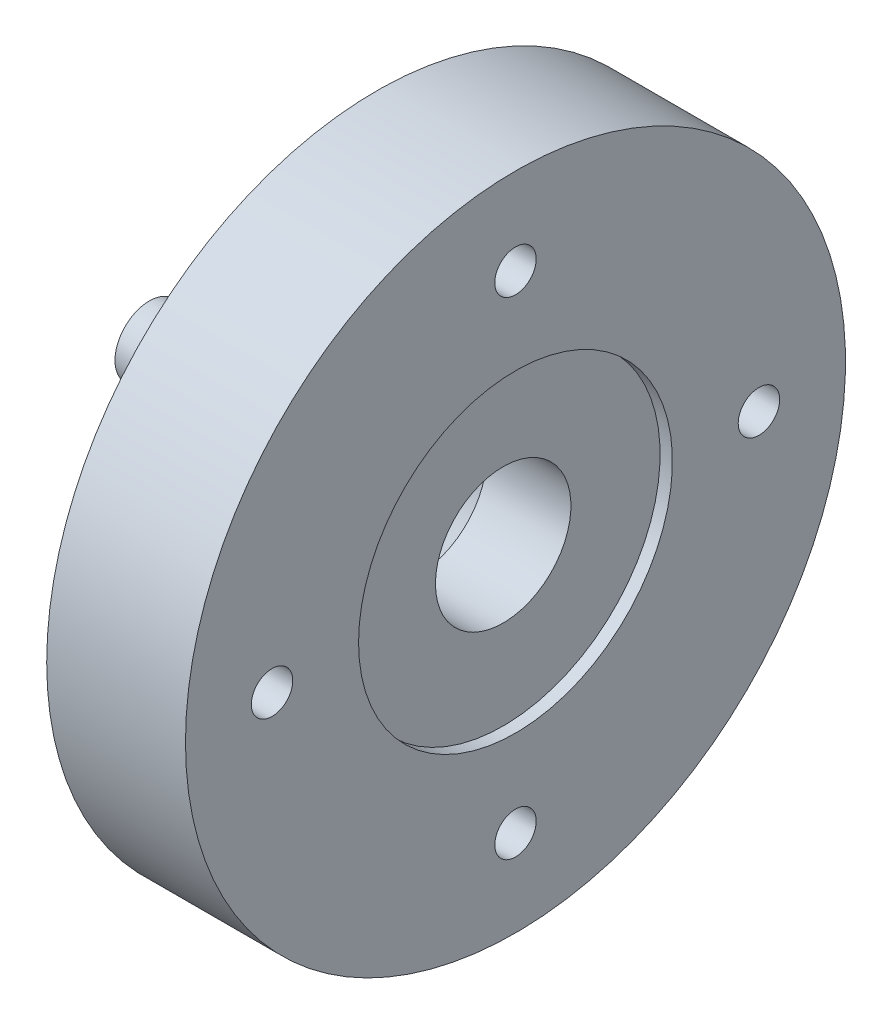
ISO-10303-21;
HEADER;
FILE_DESCRIPTION(('STEP AP214'),'2;1');
FILE_NAME('part.step','',(''),(''),'','','');
FILE_SCHEMA(('AUTOMOTIVE_DESIGN { 1 0 10303 214 1 1 1 1 }'));
ENDSEC;
DATA;
#1=APPLICATION_CONTEXT('core data for automotive mechanical design processes');
#2=APPLICATION_PROTOCOL_DEFINITION('international standard','automotive_design',2000,#1);
#3=PRODUCT_CONTEXT('',#1,'mechanical');
#4=PRODUCT('Part','Part','',(#3));
#5=PRODUCT_RELATED_PRODUCT_CATEGORY('part','',(#4));
#6=PRODUCT_DEFINITION_FORMATION('','',#4);
#7=PRODUCT_DEFINITION_CONTEXT('part definition',#1,'design');
#8=PRODUCT_DEFINITION('design','',#6,#7);
#9=PRODUCT_DEFINITION_SHAPE('','',#8);
#10=(LENGTH_UNIT() NAMED_UNIT(*) SI_UNIT(.MILLI.,.METRE.));
#11=(NAMED_UNIT(*) PLANE_ANGLE_UNIT() SI_UNIT($,.RADIAN.));
#12=(NAMED_UNIT(*) SI_UNIT($,.STERADIAN.) SOLID_ANGLE_UNIT());
#13=UNCERTAINTY_MEASURE_WITH_UNIT(LENGTH_MEASURE(1.E-05),#10,'distance_accuracy_value','');
#14=(GEOMETRIC_REPRESENTATION_CONTEXT(3) GLOBAL_UNCERTAINTY_ASSIGNED_CONTEXT((#13)) GLOBAL_UNIT_ASSIGNED_CONTEXT((#10,
#11,#12)) REPRESENTATION_CONTEXT('',''));
#15=CARTESIAN_POINT('',(0.,0.,0.));
#16=DIRECTION('',(0.,0.,1.));
#17=DIRECTION('',(1.,0.,0.));
#18=AXIS2_PLACEMENT_3D('',#15,#16,#17);
#19=CARTESIAN_POINT('',(-71.2918592683267,11.7141702218951,0.));
#20=DIRECTION('',(1.,0.,0.));
#21=DIRECTION('',(0.,0.,-1.));
#22=AXIS2_PLACEMENT_3D('',#19,#20,#21);
#23=CONICAL_SURFACE('',#22,3.17,0.0784901026373288);
#24=CARTESIAN_POINT('',(-75.7418592683269,11.7141702218951,0.));
#25=DIRECTION('',(-1.,0.,0.));
#26=DIRECTION('',(0.,0.,1.));
#27=AXIS2_PLACEMENT_3D('',#24,#25,#26);
#28=CIRCLE('',#27,2.82);
#29=CARTESIAN_POINT('',(-75.7418592683269,11.7141702218951,2.82));
#30=VERTEX_POINT('',#29);
#31=EDGE_CURVE('E92',#30,#30,#28,.T.);
#32=ORIENTED_EDGE('',*,*,#31,.F.);
#33=EDGE_LOOP('',(#32));
#34=FACE_BOUND('',#33,.T.);
#35=CARTESIAN_POINT('',(-71.2918592683267,11.7141702218951,0.));
#36=DIRECTION('',(-1.,0.,0.));
#37=DIRECTION('',(0.,0.,1.));
#38=AXIS2_PLACEMENT_3D('',#35,#36,#37);
#39=CIRCLE('',#38,3.17);
#40=CARTESIAN_POINT('',(-71.2918592683267,11.7141702218951,3.17));
#41=VERTEX_POINT('',#40);
#42=EDGE_CURVE('E10',#41,#41,#39,.T.);
#43=ORIENTED_EDGE('',*,*,#42,.T.);
#44=EDGE_LOOP('',(#43));
#45=FACE_BOUND('',#44,.T.);
#46=ADVANCED_FACE('F37',(#34,#45),#23,.T.);
#47=CARTESIAN_POINT('',(-71.2918592683267,14.8841702218951,0.));
#48=DIRECTION('',(-1.,0.,0.));
#49=DIRECTION('',(0.,0.,1.));
#50=AXIS2_PLACEMENT_3D('',#47,#48,#49);
#51=PLANE('',#50);
#52=ORIENTED_EDGE('',*,*,#42,.F.);
#53=EDGE_LOOP('',(#52));
#54=FACE_BOUND('',#53,.T.);
#55=CARTESIAN_POINT('',(-71.2918592683267,11.7141702218951,0.));
#56=DIRECTION('',(-1.,0.,0.));
#57=DIRECTION('',(0.,0.,1.));
#58=AXIS2_PLACEMENT_3D('',#55,#56,#57);
#59=CIRCLE('',#58,2.82);
#60=CARTESIAN_POINT('',(-71.2918592683267,11.7141702218951,2.82));
#61=VERTEX_POINT('',#60);
#62=EDGE_CURVE('E43',#61,#61,#59,.T.);
#63=ORIENTED_EDGE('',*,*,#62,.T.);
#64=EDGE_LOOP('',(#63));
#65=FACE_BOUND('',#64,.T.);
#66=ADVANCED_FACE('F224',(#54,#65),#51,.F.);
#67=CARTESIAN_POINT('',(-66.841859268327,11.7141702218951,0.));
#68=DIRECTION('',(1.,0.,0.));
#69=DIRECTION('',(0.,0.,-1.));
#70=AXIS2_PLACEMENT_3D('',#67,#68,#69);
#71=CONICAL_SURFACE('',#70,3.17,0.0784901026373366);
#72=ORIENTED_EDGE('',*,*,#62,.F.);
#73=EDGE_LOOP('',(#72));
#74=FACE_BOUND('',#73,.T.);
#75=CARTESIAN_POINT('',(-66.841859268327,11.7141702218951,0.));
#76=DIRECTION('',(-1.,0.,0.));
#77=DIRECTION('',(0.,0.,1.));
#78=AXIS2_PLACEMENT_3D('',#75,#76,#77);
#79=CIRCLE('',#78,3.17);
#80=CARTESIAN_POINT('',(-66.841859268327,11.7141702218951,3.17));
#81=VERTEX_POINT('',#80);
#82=EDGE_CURVE('E47',#81,#81,#79,.T.);
#83=ORIENTED_EDGE('',*,*,#82,.T.);
#84=EDGE_LOOP('',(#83));
#85=FACE_BOUND('',#84,.T.);
#86=ADVANCED_FACE('F228',(#74,#85),#71,.T.);
#87=CARTESIAN_POINT('',(-66.8418592683269,14.8841702218951,0.));
#88=DIRECTION('',(-1.,0.,0.));
#89=DIRECTION('',(0.,0.,1.));
#90=AXIS2_PLACEMENT_3D('',#87,#88,#89);
#91=PLANE('',#90);
#92=ORIENTED_EDGE('',*,*,#82,.F.);
#93=EDGE_LOOP('',(#92));
#94=FACE_BOUND('',#93,.T.);
#95=CARTESIAN_POINT('',(-66.841859268327,11.7141702218951,0.));
#96=DIRECTION('',(-1.,0.,0.));
#97=DIRECTION('',(0.,0.,1.));
#98=AXIS2_PLACEMENT_3D('',#95,#96,#97);
#99=CIRCLE('',#98,2.82);
#100=CARTESIAN_POINT('',(-66.841859268327,11.7141702218951,2.82));
#101=VERTEX_POINT('',#100);
#102=EDGE_CURVE('E51',#101,#101,#99,.T.);
#103=ORIENTED_EDGE('',*,*,#102,.T.);
#104=EDGE_LOOP('',(#103));
#105=FACE_BOUND('',#104,.T.);
#106=ADVANCED_FACE('F233',(#94,#105),#91,.F.);
#107=CARTESIAN_POINT('',(-62.3716094477877,11.7141702218951,0.));
#108=DIRECTION('',(1.,0.,0.));
#109=DIRECTION('',(0.,0.,-1.));
#110=AXIS2_PLACEMENT_3D('',#107,#108,#109);
#111=CONICAL_SURFACE('',#110,3.17,0.0781359983486207);
#112=ORIENTED_EDGE('',*,*,#102,.F.);
#113=EDGE_LOOP('',(#112));
#114=FACE_BOUND('',#113,.T.);
#115=CARTESIAN_POINT('',(-62.3716094477877,11.7141702218951,0.));
#116=DIRECTION('',(-1.,0.,0.));
#117=DIRECTION('',(0.,0.,1.));
#118=AXIS2_PLACEMENT_3D('',#115,#116,#117);
#119=CIRCLE('',#118,3.17);
#120=CARTESIAN_POINT('',(-62.3716094477877,11.7141702218951,3.17));
#121=VERTEX_POINT('',#120);
#122=EDGE_CURVE('E56',#121,#121,#119,.T.);
#123=ORIENTED_EDGE('',*,*,#122,.T.);
#124=EDGE_LOOP('',(#123));
#125=FACE_BOUND('',#124,.T.);
#126=ADVANCED_FACE('F239',(#114,#125),#111,.T.);
#127=CARTESIAN_POINT('',(-62.3716094477878,14.8841702218951,0.));
#128=DIRECTION('',(-1.,0.,0.));
#129=DIRECTION('',(0.,0.,1.));
#130=AXIS2_PLACEMENT_3D('',#127,#128,#129);
#131=PLANE('',#130);
#132=ORIENTED_EDGE('',*,*,#122,.F.);
#133=EDGE_LOOP('',(#132));
#134=FACE_BOUND('',#133,.T.);
#135=CARTESIAN_POINT('',(-62.3716094477877,11.7141702218951,0.));
#136=DIRECTION('',(-1.,0.,0.));
#137=DIRECTION('',(0.,0.,1.));
#138=AXIS2_PLACEMENT_3D('',#135,#136,#137);
#139=CIRCLE('',#138,2.82);
#140=CARTESIAN_POINT('',(-62.3716094477877,11.7141702218951,-2.82000000000001));
#141=VERTEX_POINT('',#140);
#142=EDGE_CURVE('E59',#141,#141,#139,.T.);
#143=ORIENTED_EDGE('',*,*,#142,.T.);
#144=EDGE_LOOP('',(#143));
#145=FACE_BOUND('',#144,.T.);
#146=ADVANCED_FACE('F243',(#134,#145),#131,.F.);
#147=CARTESIAN_POINT('',(-59.4889180755963,11.7141702218951,0.));
#148=DIRECTION('',(1.,0.,0.));
#149=DIRECTION('',(0.,0.,-1.));
#150=AXIS2_PLACEMENT_3D('',#147,#148,#149);
#151=CONICAL_SURFACE('',#150,12.0738754304226,1.2688119953633);
#152=CARTESIAN_POINT('',(-59.4889180755963,11.7141702218951,0.));
#153=DIRECTION('',(-1.,0.,0.));
#154=DIRECTION('',(0.,0.,1.));
#155=AXIS2_PLACEMENT_3D('',#152,#153,#154);
#156=CIRCLE('',#155,12.0738754304226);
#157=CARTESIAN_POINT('',(-59.4889180755963,11.7141702218951,-12.0738754304226));
#158=VERTEX_POINT('',#157);
#159=EDGE_CURVE('E62',#158,#158,#156,.T.);
#160=CARTESIAN_POINT('',(-62.3716094477877,11.7141702218951,-2.82000000000001));
#161=CARTESIAN_POINT('',(-62.3415814126608,11.7141702218951,-2.91639453573358));
#162=CARTESIAN_POINT('',(-62.3115533775338,11.7141702218951,-3.01278907146714));
#163=CARTESIAN_POINT('',(-62.2514973072798,11.7141702218951,-3.20557814293428));
#164=CARTESIAN_POINT('',(-62.2214692721528,11.7141702218951,-3.30197267866785));
#165=CARTESIAN_POINT('',(-62.1614132018988,11.7141702218951,-3.49476175013499));
#166=CARTESIAN_POINT('',(-62.1313851667718,11.7141702218951,-3.59115628586855));
#167=CARTESIAN_POINT('',(-62.0713290965178,11.7141702218951,-3.78394535733569));
#168=CARTESIAN_POINT('',(-62.0413010613908,11.7141702218951,-3.88033989306926));
#169=CARTESIAN_POINT('',(-61.9812449911368,11.7141702218951,-4.0731289645364));
#170=CARTESIAN_POINT('',(-61.9512169560098,11.7141702218951,-4.16952350026996));
#171=CARTESIAN_POINT('',(-61.8911608857558,11.7141702218951,-4.3623125717371));
#172=CARTESIAN_POINT('',(-61.8611328506288,11.7141702218951,-4.45870710747067));
#173=CARTESIAN_POINT('',(-61.8010767803748,11.7141702218951,-4.6514961789378));
#174=CARTESIAN_POINT('',(-61.7710487452479,11.7141702218951,-4.74789071467137));
#175=CARTESIAN_POINT('',(-61.7109926749939,11.7141702218951,-4.94067978613851));
#176=CARTESIAN_POINT('',(-61.6809646398669,11.7141702218951,-5.03707432187208));
#177=CARTESIAN_POINT('',(-61.6209085696129,11.7141702218951,-5.22986339333921));
#178=CARTESIAN_POINT('',(-61.5908805344859,11.7141702218951,-5.32625792907278));
#179=CARTESIAN_POINT('',(-61.5308244642319,11.7141702218951,-5.51904700053992));
#180=CARTESIAN_POINT('',(-61.5007964291049,11.7141702218951,-5.61544153627349));
#181=CARTESIAN_POINT('',(-61.4407403588509,11.7141702218951,-5.80823060774062));
#182=CARTESIAN_POINT('',(-61.4107123237239,11.7141702218951,-5.90462514347419));
#183=CARTESIAN_POINT('',(-61.3506562534699,11.7141702218951,-6.09741421494133));
#184=CARTESIAN_POINT('',(-61.3206282183429,11.7141702218951,-6.1938087506749));
#185=CARTESIAN_POINT('',(-61.260572148089,11.7141702218951,-6.38659782214203));
#186=CARTESIAN_POINT('',(-61.230544112962,11.7141702218951,-6.4829923578756));
#187=CARTESIAN_POINT('',(-61.170488042708,11.7141702218951,-6.67578142934274));
#188=CARTESIAN_POINT('',(-61.140460007581,11.7141702218951,-6.77217596507631));
#189=CARTESIAN_POINT('',(-61.080403937327,11.7141702218951,-6.96496503654344));
#190=CARTESIAN_POINT('',(-61.0503759022,11.7141702218951,-7.06135957227701));
#191=CARTESIAN_POINT('',(-60.990319831946,11.7141702218951,-7.25414864374415));
#192=CARTESIAN_POINT('',(-60.960291796819,11.7141702218951,-7.35054317947772));
#193=CARTESIAN_POINT('',(-60.900235726565,11.7141702218951,-7.54333225094485));
#194=CARTESIAN_POINT('',(-60.870207691438,11.7141702218951,-7.63972678667842));
#195=CARTESIAN_POINT('',(-60.810151621184,11.7141702218951,-7.83251585814556));
#196=CARTESIAN_POINT('',(-60.7801235860571,11.7141702218951,-7.92891039387913));
#197=CARTESIAN_POINT('',(-60.7200675158031,11.7141702218951,-8.12169946534626));
#198=CARTESIAN_POINT('',(-60.6900394806761,11.7141702218951,-8.21809400107983));
#199=CARTESIAN_POINT('',(-60.6299834104221,11.7141702218951,-8.41088307254697));
#200=CARTESIAN_POINT('',(-60.5999553752951,11.7141702218951,-8.50727760828054));
#201=CARTESIAN_POINT('',(-60.5398993050411,11.7141702218951,-8.70006667974767));
#202=CARTESIAN_POINT('',(-60.5098712699141,11.7141702218951,-8.79646121548124));
#203=CARTESIAN_POINT('',(-60.4498151996601,11.7141702218951,-8.98925028694838));
#204=CARTESIAN_POINT('',(-60.4197871645331,11.7141702218951,-9.08564482268195));
#205=CARTESIAN_POINT('',(-60.3597310942791,11.7141702218951,-9.27843389414908));
#206=CARTESIAN_POINT('',(-60.3297030591521,11.7141702218951,-9.37482842988265));
#207=CARTESIAN_POINT('',(-60.2696469888982,11.7141702218951,-9.56761750134979));
#208=CARTESIAN_POINT('',(-60.2396189537712,11.7141702218951,-9.66401203708335));
#209=CARTESIAN_POINT('',(-60.1795628835172,11.7141702218951,-9.85680110855049));
#210=CARTESIAN_POINT('',(-60.1495348483902,11.7141702218951,-9.95319564428406));
#211=CARTESIAN_POINT('',(-60.0894787781362,11.7141702218951,-10.1459847157512));
#212=CARTESIAN_POINT('',(-60.0594507430092,11.7141702218951,-10.2423792514848));
#213=CARTESIAN_POINT('',(-59.9993946727552,11.7141702218951,-10.4351683229519));
#214=CARTESIAN_POINT('',(-59.9693666376282,11.7141702218951,-10.5315628586855));
#215=CARTESIAN_POINT('',(-59.9093105673742,11.7141702218951,-10.7243519301526));
#216=CARTESIAN_POINT('',(-59.8792825322472,11.7141702218951,-10.8207464658862));
#217=CARTESIAN_POINT('',(-59.8192264619932,11.7141702218951,-11.0135355373533));
#218=CARTESIAN_POINT('',(-59.7891984268662,11.7141702218951,-11.1099300730869));
#219=CARTESIAN_POINT('',(-59.7291423566123,11.7141702218951,-11.302719144554));
#220=CARTESIAN_POINT('',(-59.6991143214853,11.7141702218951,-11.3991136802876));
#221=CARTESIAN_POINT('',(-59.6390582512313,11.7141702218951,-11.5919027517547));
#222=CARTESIAN_POINT('',(-59.6090302161043,11.7141702218951,-11.6882972874883));
#223=CARTESIAN_POINT('',(-59.5489741458503,11.7141702218951,-11.8810863589554));
#224=CARTESIAN_POINT('',(-59.5189461107233,11.7141702218951,-11.977480894689));
#225=CARTESIAN_POINT('',(-59.4889180755963,11.7141702218951,-12.0738754304226));
#226=B_SPLINE_CURVE_WITH_KNOTS('',3,(#160,#161,#162,#163,#164,#165,#166,#167,#168,#169,#170,
#171,#172,#173,#174,#175,#176,#177,#178,#179,#180,#181,#182,#183,#184,#185,#186,#187,#188,#189,
#190,#191,#192,#193,#194,#195,#196,#197,#198,#199,#200,#201,#202,#203,#204,#205,#206,#207,#208,
#209,#210,#211,#212,#213,#214,#215,#216,#217,#218,#219,#220,#221,#222,#223,#224,#225),
.UNSPECIFIED.,.F.,.F.,(4,2,2,2,2,2,2,2,2,2,2,2,2,2,2,2,2,2,2,2,2,2,2,2,2,2,2,2,2,2,2,2,4),(0.,
0.302889921780016,0.605779843560032,0.908669765340045,1.21155968712006,1.51444960890007,
1.81733953068009,2.1202294524601,2.42311937424012,2.72600929602013,3.02889921780015,
3.33178913958016,3.63467906136018,3.93756898314019,4.24045890492021,4.54334882670022,
4.84623874848024,5.14912867026025,5.45201859204027,5.75490851382028,6.0577984356003,
6.36068835738031,6.66357827916033,6.96646820094034,7.26935812272036,7.57224804450037,
7.87513796628039,8.1780278880604,8.48091780984041,8.78380773162043,9.08669765340045,
9.38958757518046,9.69247749696047),.UNSPECIFIED.);
#227=EDGE_CURVE('BSEAM247',#141,#158,#226,.T.);
#228=ORIENTED_EDGE('',*,*,#142,.F.);
#229=ORIENTED_EDGE('',*,*,#159,.T.);
#230=ORIENTED_EDGE('',*,*,#227,.T.);
#231=ORIENTED_EDGE('',*,*,#227,.F.);
#232=EDGE_LOOP('',(#228,#230,#229,#231));
#233=FACE_BOUND('',#232,.T.);
#234=ADVANCED_FACE('F247',(#233),#151,.T.);
#235=CARTESIAN_POINT('',(-795.163849312577,11.7141702218951,0.));
#236=DIRECTION('',(-1.,0.,0.));
#237=DIRECTION('',(0.,0.,1.));
#238=AXIS2_PLACEMENT_3D('',#235,#236,#237);
#239=CYLINDRICAL_SURFACE('',#238,12.0738754304226);
#240=ORIENTED_EDGE('',*,*,#159,.F.);
#241=EDGE_LOOP('',(#240));
#242=FACE_BOUND('',#241,.T.);
#243=CARTESIAN_POINT('',(-57.0912148072447,11.7141702218951,0.));
#244=DIRECTION('',(-1.,0.,0.));
#245=DIRECTION('',(0.,0.,1.));
#246=AXIS2_PLACEMENT_3D('',#243,#244,#245);
#247=CIRCLE('',#246,12.0738754304226);
#248=CARTESIAN_POINT('',(-57.0912148072447,11.7141702218951,12.0738754304226));
#249=VERTEX_POINT('',#248);
#250=EDGE_CURVE('E65',#249,#249,#247,.T.);
#251=ORIENTED_EDGE('',*,*,#250,.T.);
#252=EDGE_LOOP('',(#251));
#253=FACE_BOUND('',#252,.T.);
#254=ADVANCED_FACE('F162',(#242,#253),#239,.T.);
#255=CARTESIAN_POINT('',(-57.0912148072447,38.7880456523176,0.));
#256=DIRECTION('',(1.,0.,0.));
#257=DIRECTION('',(0.,0.,-1.));
#258=AXIS2_PLACEMENT_3D('',#255,#256,#257);
#259=PLANE('',#258);
#260=CARTESIAN_POINT('',(-57.0912148072447,31.6852610835262,0.));
#261=DIRECTION('',(-1.,0.,0.));
#262=DIRECTION('',(0.,0.,1.));
#263=AXIS2_PLACEMENT_3D('',#260,#261,#262);
#264=CIRCLE('',#263,3.275);
#265=CARTESIAN_POINT('',(-57.0912148072447,31.6852610835262,3.275));
#266=VERTEX_POINT('',#265);
#267=EDGE_CURVE('E152',#266,#266,#264,.T.);
#268=ORIENTED_EDGE('',*,*,#267,.F.);
#269=EDGE_LOOP('',(#268));
#270=FACE_BOUND('',#269,.T.);
#271=CARTESIAN_POINT('',(-57.0912148072447,11.7141702218951,19.9710908616312));
#272=DIRECTION('',(-1.,0.,0.));
#273=DIRECTION('',(0.,0.,1.));
#274=AXIS2_PLACEMENT_3D('',#271,#272,#273);
#275=CIRCLE('',#274,3.275);
#276=CARTESIAN_POINT('',(-57.0912148072447,11.7141702218951,23.2460908616312));
#277=VERTEX_POINT('',#276);
#278=EDGE_CURVE('E137',#277,#277,#275,.T.);
#279=ORIENTED_EDGE('',*,*,#278,.F.);
#280=EDGE_LOOP('',(#279));
#281=FACE_BOUND('',#280,.T.);
#282=CARTESIAN_POINT('',(-57.0912148072447,-8.25692063973612,0.));
#283=DIRECTION('',(-1.,0.,0.));
#284=DIRECTION('',(0.,0.,1.));
#285=AXIS2_PLACEMENT_3D('',#282,#283,#284);
#286=CIRCLE('',#285,3.275);
#287=CARTESIAN_POINT('',(-57.0912148072447,-8.25692063973612,3.275));
#288=VERTEX_POINT('',#287);
#289=EDGE_CURVE('E122',#288,#288,#286,.T.);
#290=ORIENTED_EDGE('',*,*,#289,.F.);
#291=EDGE_LOOP('',(#290));
#292=FACE_BOUND('',#291,.T.);
#293=CARTESIAN_POINT('',(-57.0912148072447,11.7141702218951,-19.9710908616312));
#294=DIRECTION('',(-1.,0.,0.));
#295=DIRECTION('',(0.,0.,1.));
#296=AXIS2_PLACEMENT_3D('',#293,#294,#295);
#297=CIRCLE('',#296,3.275);
#298=CARTESIAN_POINT('',(-57.0912148072447,11.7141702218951,-16.6960908616312));
#299=VERTEX_POINT('',#298);
#300=EDGE_CURVE('E107',#299,#299,#297,.T.);
#301=ORIENTED_EDGE('',*,*,#300,.F.);
#302=EDGE_LOOP('',(#301));
#303=FACE_BOUND('',#302,.T.);
#304=ORIENTED_EDGE('',*,*,#250,.F.);
#305=EDGE_LOOP('',(#304));
#306=FACE_BOUND('',#305,.T.);
#307=CARTESIAN_POINT('',(-57.0912148072447,11.7141702218951,0.));
#308=DIRECTION('',(-1.,0.,0.));
#309=DIRECTION('',(0.,0.,1.));
#310=AXIS2_PLACEMENT_3D('',#307,#308,#309);
#311=CIRCLE('',#310,27.0738754304226);
#312=CARTESIAN_POINT('',(-57.0912148072447,11.7141702218951,27.0738754304226));
#313=VERTEX_POINT('',#312);
#314=EDGE_CURVE('E68',#313,#313,#311,.T.);
#315=ORIENTED_EDGE('',*,*,#314,.T.);
#316=EDGE_LOOP('',(#315));
#317=FACE_BOUND('',#316,.T.);
#318=ADVANCED_FACE('F158',(#270,#281,#292,#303,#306,#317),#259,.F.);
#319=CARTESIAN_POINT('',(-795.163849312577,11.7141702218951,0.));
#320=DIRECTION('',(-1.,0.,0.));
#321=DIRECTION('',(0.,0.,1.));
#322=AXIS2_PLACEMENT_3D('',#319,#320,#321);
#323=CYLINDRICAL_SURFACE('',#322,27.0738754304226);
#324=ORIENTED_EDGE('',*,*,#314,.F.);
#325=EDGE_LOOP('',(#324));
#326=FACE_BOUND('',#325,.T.);
#327=CARTESIAN_POINT('',(-45.7058116481793,11.7141702218951,0.));
#328=DIRECTION('',(-1.,0.,0.));
#329=DIRECTION('',(0.,0.,1.));
#330=AXIS2_PLACEMENT_3D('',#327,#328,#329);
#331=CIRCLE('',#330,27.0738754304226);
#332=CARTESIAN_POINT('',(-45.7058116481793,11.7141702218951,27.0738754304226));
#333=VERTEX_POINT('',#332);
#334=EDGE_CURVE('E71',#333,#333,#331,.T.);
#335=ORIENTED_EDGE('',*,*,#334,.T.);
#336=EDGE_LOOP('',(#335));
#337=FACE_BOUND('',#336,.T.);
#338=ADVANCED_FACE('F161',(#326,#337),#323,.T.);
#339=CARTESIAN_POINT('',(-45.7058116481793,26.202485581554,0.));
#340=DIRECTION('',(-1.,0.,0.));
#341=DIRECTION('',(0.,0.,1.));
#342=AXIS2_PLACEMENT_3D('',#339,#340,#341);
#343=PLANE('',#342);
#344=CARTESIAN_POINT('',(-45.7058116481793,31.6852610835262,0.));
#345=DIRECTION('',(-1.,0.,0.));
#346=DIRECTION('',(0.,0.,1.));
#347=AXIS2_PLACEMENT_3D('',#344,#345,#346);
#348=CIRCLE('',#347,1.7);
#349=CARTESIAN_POINT('',(-45.7058116481793,31.6852610835262,1.7));
#350=VERTEX_POINT('',#349);
#351=EDGE_CURVE('E140',#350,#350,#348,.T.);
#352=ORIENTED_EDGE('',*,*,#351,.T.);
#353=EDGE_LOOP('',(#352));
#354=FACE_BOUND('',#353,.T.);
#355=CARTESIAN_POINT('',(-45.7058116481793,11.7141702218951,19.9710908616312));
#356=DIRECTION('',(-1.,0.,0.));
#357=DIRECTION('',(0.,0.,1.));
#358=AXIS2_PLACEMENT_3D('',#355,#356,#357);
#359=CIRCLE('',#358,1.7);
#360=CARTESIAN_POINT('',(-45.7058116481793,11.7141702218951,21.6710908616312));
#361=VERTEX_POINT('',#360);
#362=EDGE_CURVE('E125',#361,#361,#359,.T.);
#363=ORIENTED_EDGE('',*,*,#362,.T.);
#364=EDGE_LOOP('',(#363));
#365=FACE_BOUND('',#364,.T.);
#366=CARTESIAN_POINT('',(-45.7058116481793,-8.25692063973612,0.));
#367=DIRECTION('',(-1.,0.,0.));
#368=DIRECTION('',(0.,0.,1.));
#369=AXIS2_PLACEMENT_3D('',#366,#367,#368);
#370=CIRCLE('',#369,1.7);
#371=CARTESIAN_POINT('',(-45.7058116481793,-8.25692063973612,1.7));
#372=VERTEX_POINT('',#371);
#373=EDGE_CURVE('E110',#372,#372,#370,.T.);
#374=ORIENTED_EDGE('',*,*,#373,.T.);
#375=EDGE_LOOP('',(#374));
#376=FACE_BOUND('',#375,.T.);
#377=CARTESIAN_POINT('',(-45.7058116481793,11.7141702218951,-19.9710908616312));
#378=DIRECTION('',(-1.,0.,0.));
#379=DIRECTION('',(0.,0.,1.));
#380=AXIS2_PLACEMENT_3D('',#377,#378,#379);
#381=CIRCLE('',#380,1.7);
#382=CARTESIAN_POINT('',(-45.7058116481793,11.7141702218951,-18.2710908616312));
#383=VERTEX_POINT('',#382);
#384=EDGE_CURVE('E95',#383,#383,#381,.T.);
#385=ORIENTED_EDGE('',*,*,#384,.T.);
#386=EDGE_LOOP('',(#385));
#387=FACE_BOUND('',#386,.T.);
#388=ORIENTED_EDGE('',*,*,#334,.F.);
#389=EDGE_LOOP('',(#388));
#390=FACE_BOUND('',#389,.T.);
#391=CARTESIAN_POINT('',(-45.7058116481793,11.7141702218951,0.));
#392=DIRECTION('',(-1.,0.,0.));
#393=DIRECTION('',(0.,0.,1.));
#394=AXIS2_PLACEMENT_3D('',#391,#392,#393);
#395=CIRCLE('',#394,12.875);
#396=CARTESIAN_POINT('',(-45.7058116481793,11.7141702218951,12.875));
#397=VERTEX_POINT('',#396);
#398=EDGE_CURVE('E74',#397,#397,#395,.T.);
#399=ORIENTED_EDGE('',*,*,#398,.T.);
#400=EDGE_LOOP('',(#399));
#401=FACE_BOUND('',#400,.T.);
#402=ADVANCED_FACE('F176',(#354,#365,#376,#387,#390,#401),#343,.F.);
#403=CARTESIAN_POINT('',(-795.163849312577,11.7141702218951,0.));
#404=DIRECTION('',(-1.,0.,0.));
#405=DIRECTION('',(0.,0.,1.));
#406=AXIS2_PLACEMENT_3D('',#403,#404,#405);
#407=CYLINDRICAL_SURFACE('',#406,12.875);
#408=ORIENTED_EDGE('',*,*,#398,.F.);
#409=EDGE_LOOP('',(#408));
#410=FACE_BOUND('',#409,.T.);
#411=CARTESIAN_POINT('',(-46.7158116481793,11.7141702218951,0.));
#412=DIRECTION('',(-1.,0.,0.));
#413=DIRECTION('',(0.,0.,1.));
#414=AXIS2_PLACEMENT_3D('',#411,#412,#413);
#415=CIRCLE('',#414,12.875);
#416=CARTESIAN_POINT('',(-46.7158116481793,11.7141702218951,12.875));
#417=VERTEX_POINT('',#416);
#418=EDGE_CURVE('E77',#417,#417,#415,.T.);
#419=ORIENTED_EDGE('',*,*,#418,.T.);
#420=EDGE_LOOP('',(#419));
#421=FACE_BOUND('',#420,.T.);
#422=ADVANCED_FACE('F182',(#410,#421),#407,.F.);
#423=CARTESIAN_POINT('',(-46.7158116481793,24.5891702218951,0.));
#424=DIRECTION('',(-1.,0.,0.));
#425=DIRECTION('',(0.,0.,1.));
#426=AXIS2_PLACEMENT_3D('',#423,#424,#425);
#427=PLANE('',#426);
#428=ORIENTED_EDGE('',*,*,#418,.F.);
#429=EDGE_LOOP('',(#428));
#430=FACE_BOUND('',#429,.T.);
#431=CARTESIAN_POINT('',(-46.7158116481793,11.7141702218951,0.));
#432=DIRECTION('',(-1.,0.,0.));
#433=DIRECTION('',(0.,0.,1.));
#434=AXIS2_PLACEMENT_3D('',#431,#432,#433);
#435=CIRCLE('',#434,5.55625);
#436=CARTESIAN_POINT('',(-46.7158116481793,11.7141702218951,5.55625));
#437=VERTEX_POINT('',#436);
#438=EDGE_CURVE('E80',#437,#437,#435,.T.);
#439=ORIENTED_EDGE('',*,*,#438,.T.);
#440=EDGE_LOOP('',(#439));
#441=FACE_BOUND('',#440,.T.);
#442=ADVANCED_FACE('F189',(#430,#441),#427,.F.);
#443=CARTESIAN_POINT('',(-795.163849312577,11.7141702218951,0.));
#444=DIRECTION('',(-1.,0.,0.));
#445=DIRECTION('',(0.,0.,1.));
#446=AXIS2_PLACEMENT_3D('',#443,#444,#445);
#447=CYLINDRICAL_SURFACE('',#446,5.55625);
#448=ORIENTED_EDGE('',*,*,#438,.F.);
#449=EDGE_LOOP('',(#448));
#450=FACE_BOUND('',#449,.T.);
#451=CARTESIAN_POINT('',(-53.6375454837529,11.7141702218951,0.));
#452=DIRECTION('',(-1.,0.,0.));
#453=DIRECTION('',(0.,0.,1.));
#454=AXIS2_PLACEMENT_3D('',#451,#452,#453);
#455=CIRCLE('',#454,5.55625);
#456=CARTESIAN_POINT('',(-53.6375454837529,11.7141702218951,-5.55625));
#457=VERTEX_POINT('',#456);
#458=EDGE_CURVE('E83',#457,#457,#455,.T.);
#459=ORIENTED_EDGE('',*,*,#458,.T.);
#460=EDGE_LOOP('',(#459));
#461=FACE_BOUND('',#460,.T.);
#462=ADVANCED_FACE('F195',(#450,#461),#447,.F.);
#463=CARTESIAN_POINT('',(-59.4889180755963,11.7141702218951,0.));
#464=DIRECTION('',(1.,0.,0.));
#465=DIRECTION('',(0.,0.,-1.));
#466=AXIS2_PLACEMENT_3D('',#463,#464,#465);
#467=CONICAL_SURFACE('',#466,1.685,0.584484551556547);
#468=CARTESIAN_POINT('',(-59.4889180755963,11.7141702218951,0.));
#469=DIRECTION('',(-1.,0.,0.));
#470=DIRECTION('',(0.,0.,1.));
#471=AXIS2_PLACEMENT_3D('',#468,#469,#470);
#472=CIRCLE('',#471,1.685);
#473=CARTESIAN_POINT('',(-59.4889180755963,11.7141702218951,-1.685));
#474=VERTEX_POINT('',#473);
#475=EDGE_CURVE('E86',#474,#474,#472,.T.);
#476=CARTESIAN_POINT('',(-53.6375454837529,11.7141702218951,-5.55625));
#477=CARTESIAN_POINT('',(-53.6984972815846,11.7141702218951,-5.51592447916667));
#478=CARTESIAN_POINT('',(-53.7594490794163,11.7141702218951,-5.47559895833334));
#479=CARTESIAN_POINT('',(-53.8813526750797,11.7141702218951,-5.39494791666667));
#480=CARTESIAN_POINT('',(-53.9423044729114,11.7141702218951,-5.35462239583333));
#481=CARTESIAN_POINT('',(-54.0642080685748,11.7141702218951,-5.27397135416667));
#482=CARTESIAN_POINT('',(-54.1251598664065,11.7141702218951,-5.23364583333333));
#483=CARTESIAN_POINT('',(-54.2470634620699,11.7141702218951,-5.15299479166667));
#484=CARTESIAN_POINT('',(-54.3080152599016,11.7141702218951,-5.11266927083333));
#485=CARTESIAN_POINT('',(-54.429918855565,11.7141702218951,-5.03201822916667));
#486=CARTESIAN_POINT('',(-54.4908706533967,11.7141702218951,-4.99169270833333));
#487=CARTESIAN_POINT('',(-54.6127742490601,11.7141702218951,-4.91104166666667));
#488=CARTESIAN_POINT('',(-54.6737260468918,11.7141702218951,-4.87071614583333));
#489=CARTESIAN_POINT('',(-54.7956296425552,11.7141702218951,-4.79006510416667));
#490=CARTESIAN_POINT('',(-54.8565814403869,11.7141702218951,-4.74973958333334));
#491=CARTESIAN_POINT('',(-54.9784850360503,11.7141702218951,-4.66908854166667));
#492=CARTESIAN_POINT('',(-55.039436833882,11.7141702218951,-4.62876302083334));
#493=CARTESIAN_POINT('',(-55.1613404295454,11.7141702218951,-4.54811197916667));
#494=CARTESIAN_POINT('',(-55.2222922273771,11.7141702218951,-4.50778645833334));
#495=CARTESIAN_POINT('',(-55.3441958230405,11.7141702218951,-4.42713541666667));
#496=CARTESIAN_POINT('',(-55.4051476208722,11.7141702218951,-4.38680989583334));
#497=CARTESIAN_POINT('',(-55.5270512165357,11.7141702218951,-4.30615885416667));
#498=CARTESIAN_POINT('',(-55.5880030143674,11.7141702218951,-4.26583333333334));
#499=CARTESIAN_POINT('',(-55.7099066100308,11.7141702218951,-4.18518229166667));
#500=CARTESIAN_POINT('',(-55.7708584078625,11.7141702218951,-4.14485677083333));
#501=CARTESIAN_POINT('',(-55.8927620035259,11.7141702218951,-4.06420572916667));
#502=CARTESIAN_POINT('',(-55.9537138013576,11.7141702218951,-4.02388020833334));
#503=CARTESIAN_POINT('',(-56.075617397021,11.7141702218951,-3.94322916666667));
#504=CARTESIAN_POINT('',(-56.1365691948527,11.7141702218951,-3.90290364583334));
#505=CARTESIAN_POINT('',(-56.2584727905161,11.7141702218951,-3.82225260416667));
#506=CARTESIAN_POINT('',(-56.3194245883478,11.7141702218951,-3.78192708333334));
#507=CARTESIAN_POINT('',(-56.4413281840112,11.7141702218951,-3.70127604166667));
#508=CARTESIAN_POINT('',(-56.5022799818429,11.7141702218951,-3.66095052083334));
#509=CARTESIAN_POINT('',(-56.6241835775063,11.7141702218951,-3.58029947916667));
#510=CARTESIAN_POINT('',(-56.685135375338,11.7141702218951,-3.53997395833334));
#511=CARTESIAN_POINT('',(-56.8070389710014,11.7141702218951,-3.45932291666667));
#512=CARTESIAN_POINT('',(-56.8679907688331,11.7141702218951,-3.41899739583334));
#513=CARTESIAN_POINT('',(-56.9898943644965,11.7141702218951,-3.33834635416667));
#514=CARTESIAN_POINT('',(-57.0508461623282,11.7141702218951,-3.29802083333334));
#515=CARTESIAN_POINT('',(-57.1727497579916,11.7141702218951,-3.21736979166667));
#516=CARTESIAN_POINT('',(-57.2337015558233,11.7141702218951,-3.17704427083334));
#517=CARTESIAN_POINT('',(-57.3556051514867,11.7141702218951,-3.09639322916667));
#518=CARTESIAN_POINT('',(-57.4165569493184,11.7141702218951,-3.05606770833334));
#519=CARTESIAN_POINT('',(-57.5384605449818,11.7141702218951,-2.97541666666667));
#520=CARTESIAN_POINT('',(-57.5994123428135,11.7141702218951,-2.93509114583334));
#521=CARTESIAN_POINT('',(-57.7213159384769,11.7141702218951,-2.85444010416667));
#522=CARTESIAN_POINT('',(-57.7822677363086,11.7141702218951,-2.81411458333334));
#523=CARTESIAN_POINT('',(-57.904171331972,11.7141702218951,-2.73346354166667));
#524=CARTESIAN_POINT('',(-57.9651231298038,11.7141702218951,-2.69313802083334));
#525=CARTESIAN_POINT('',(-58.0870267254672,11.7141702218951,-2.61248697916667));
#526=CARTESIAN_POINT('',(-58.1479785232989,11.7141702218951,-2.57216145833334));
#527=CARTESIAN_POINT('',(-58.2698821189623,11.7141702218951,-2.49151041666667));
#528=CARTESIAN_POINT('',(-58.330833916794,11.7141702218951,-2.45118489583334));
#529=CARTESIAN_POINT('',(-58.4527375124574,11.7141702218951,-2.37053385416667));
#530=CARTESIAN_POINT('',(-58.5136893102891,11.7141702218951,-2.33020833333334));
#531=CARTESIAN_POINT('',(-58.6355929059525,11.7141702218951,-2.24955729166667));
#532=CARTESIAN_POINT('',(-58.6965447037842,11.7141702218951,-2.20923177083334));
#533=CARTESIAN_POINT('',(-58.8184482994476,11.7141702218951,-2.12858072916667));
#534=CARTESIAN_POINT('',(-58.8794000972793,11.7141702218951,-2.08825520833334));
#535=CARTESIAN_POINT('',(-59.0013036929427,11.7141702218951,-2.00760416666667));
#536=CARTESIAN_POINT('',(-59.0622554907744,11.7141702218951,-1.96727864583334));
#537=CARTESIAN_POINT('',(-59.1841590864378,11.7141702218951,-1.88662760416667));
#538=CARTESIAN_POINT('',(-59.2451108842695,11.7141702218951,-1.84630208333334));
#539=CARTESIAN_POINT('',(-59.3670144799329,11.7141702218951,-1.76565104166667));
#540=CARTESIAN_POINT('',(-59.4279662777646,11.7141702218951,-1.72532552083334));
#541=CARTESIAN_POINT('',(-59.4889180755963,11.7141702218951,-1.685));
#542=B_SPLINE_CURVE_WITH_KNOTS('',3,(#476,#477,#478,#479,#480,#481,#482,#483,#484,#485,#486,
#487,#488,#489,#490,#491,#492,#493,#494,#495,#496,#497,#498,#499,#500,#501,#502,#503,#504,#505,
#506,#507,#508,#509,#510,#511,#512,#513,#514,#515,#516,#517,#518,#519,#520,#521,#522,#523,#524,
#525,#526,#527,#528,#529,#530,#531,#532,#533,#534,#535,#536,#537,#538,#539,#540,#541),
.UNSPECIFIED.,.F.,.F.,(4,2,2,2,2,2,2,2,2,2,2,2,2,2,2,2,2,2,2,2,2,2,2,2,2,2,2,2,2,2,2,2,4),(0.,
0.219251963741644,0.438503927483287,0.65775589122493,0.877007854966574,1.09625981870822,
1.31551178244986,1.5347637461915,1.75401570993315,1.97326767367479,2.19251963741643,
2.41177160115808,2.63102356489972,2.85027552864136,3.06952749238301,3.28877945612465,
3.50803141986629,3.72728338360794,3.94653534734958,4.16578731109122,4.38503927483286,
4.60429123857451,4.82354320231615,5.04279516605779,5.26204712979944,5.48129909354108,
5.70055105728272,5.91980302102437,6.13905498476601,6.35830694850765,6.5775589122493,
6.79681087599094,7.01606283973258),.UNSPECIFIED.);
#543=EDGE_CURVE('BSEAM201',#457,#474,#542,.T.);
#544=ORIENTED_EDGE('',*,*,#458,.F.);
#545=ORIENTED_EDGE('',*,*,#475,.T.);
#546=ORIENTED_EDGE('',*,*,#543,.T.);
#547=ORIENTED_EDGE('',*,*,#543,.F.);
#548=EDGE_LOOP('',(#544,#546,#545,#547));
#549=FACE_BOUND('',#548,.T.);
#550=ADVANCED_FACE('F201',(#549),#467,.F.);
#551=CARTESIAN_POINT('',(-795.163849312577,11.7141702218951,0.));
#552=DIRECTION('',(-1.,0.,0.));
#553=DIRECTION('',(0.,0.,1.));
#554=AXIS2_PLACEMENT_3D('',#551,#552,#553);
#555=CYLINDRICAL_SURFACE('',#554,1.685);
#556=ORIENTED_EDGE('',*,*,#475,.F.);
#557=EDGE_LOOP('',(#556));
#558=FACE_BOUND('',#557,.T.);
#559=CARTESIAN_POINT('',(-75.7418592683269,11.7141702218951,0.));
#560=DIRECTION('',(-1.,0.,0.));
#561=DIRECTION('',(0.,0.,1.));
#562=AXIS2_PLACEMENT_3D('',#559,#560,#561);
#563=CIRCLE('',#562,1.685);
#564=CARTESIAN_POINT('',(-75.7418592683269,11.7141702218951,1.685));
#565=VERTEX_POINT('',#564);
#566=EDGE_CURVE('E89',#565,#565,#563,.T.);
#567=ORIENTED_EDGE('',*,*,#566,.T.);
#568=EDGE_LOOP('',(#567));
#569=FACE_BOUND('',#568,.T.);
#570=ADVANCED_FACE('F207',(#558,#569),#555,.F.);
#571=CARTESIAN_POINT('',(-75.7418592683269,13.3991702218951,0.));
#572=DIRECTION('',(1.,0.,0.));
#573=DIRECTION('',(0.,0.,-1.));
#574=AXIS2_PLACEMENT_3D('',#571,#572,#573);
#575=PLANE('',#574);
#576=ORIENTED_EDGE('',*,*,#566,.F.);
#577=EDGE_LOOP('',(#576));
#578=FACE_BOUND('',#577,.T.);
#579=ORIENTED_EDGE('',*,*,#31,.T.);
#580=EDGE_LOOP('',(#579));
#581=FACE_BOUND('',#580,.T.);
#582=ADVANCED_FACE('F213',(#578,#581),#575,.F.);
#583=CARTESIAN_POINT('',(-57.0912148072447,11.7141702218951,-19.9710908616312));
#584=DIRECTION('',(-1.,0.,0.));
#585=DIRECTION('',(0.,0.,1.));
#586=AXIS2_PLACEMENT_3D('',#583,#584,#585);
#587=CYLINDRICAL_SURFACE('',#586,1.7);
#588=ORIENTED_EDGE('',*,*,#384,.F.);
#589=EDGE_LOOP('',(#588));
#590=FACE_BOUND('',#589,.T.);
#591=CARTESIAN_POINT('',(-53.6912148072447,11.7141702218951,-19.9710908616312));
#592=DIRECTION('',(-1.,0.,0.));
#593=DIRECTION('',(0.,0.,1.));
#594=AXIS2_PLACEMENT_3D('',#591,#592,#593);
#595=CIRCLE('',#594,1.7);
#596=CARTESIAN_POINT('',(-53.6912148072447,11.7141702218951,-18.2710908616312));
#597=VERTEX_POINT('',#596);
#598=EDGE_CURVE('E98',#597,#597,#595,.T.);
#599=ORIENTED_EDGE('',*,*,#598,.T.);
#600=EDGE_LOOP('',(#599));
#601=FACE_BOUND('',#600,.T.);
#602=ADVANCED_FACE('F219',(#590,#601),#587,.F.);
#603=CARTESIAN_POINT('',(-53.6912148072447,14.9641702218951,-19.9710908616312));
#604=DIRECTION('',(1.,0.,0.));
#605=DIRECTION('',(0.,0.,-1.));
#606=AXIS2_PLACEMENT_3D('',#603,#604,#605);
#607=PLANE('',#606);
#608=ORIENTED_EDGE('',*,*,#598,.F.);
#609=EDGE_LOOP('',(#608));
#610=FACE_BOUND('',#609,.T.);
#611=CARTESIAN_POINT('',(-53.6912148072447,11.7141702218951,-19.9710908616312));
#612=DIRECTION('',(-1.,0.,0.));
#613=DIRECTION('',(0.,0.,1.));
#614=AXIS2_PLACEMENT_3D('',#611,#612,#613);
#615=CIRCLE('',#614,3.25);
#616=CARTESIAN_POINT('',(-53.6912148072447,11.7141702218951,-16.7210908616312));
#617=VERTEX_POINT('',#616);
#618=EDGE_CURVE('E101',#617,#617,#615,.T.);
#619=ORIENTED_EDGE('',*,*,#618,.T.);
#620=EDGE_LOOP('',(#619));
#621=FACE_BOUND('',#620,.T.);
#622=ADVANCED_FACE('F257',(#610,#621),#607,.F.);
#623=CARTESIAN_POINT('',(-57.0912148072447,11.7141702218951,-19.9710908616312));
#624=DIRECTION('',(-1.,0.,0.));
#625=DIRECTION('',(0.,0.,1.));
#626=AXIS2_PLACEMENT_3D('',#623,#624,#625);
#627=CYLINDRICAL_SURFACE('',#626,3.25);
#628=ORIENTED_EDGE('',*,*,#618,.F.);
#629=EDGE_LOOP('',(#628));
#630=FACE_BOUND('',#629,.T.);
#631=CARTESIAN_POINT('',(-57.0662148072447,11.7141702218951,-19.9710908616312));
#632=DIRECTION('',(-1.,0.,0.));
#633=DIRECTION('',(0.,0.,1.));
#634=AXIS2_PLACEMENT_3D('',#631,#632,#633);
#635=CIRCLE('',#634,3.25);
#636=CARTESIAN_POINT('',(-57.0662148072447,11.7141702218951,-16.7210908616312));
#637=VERTEX_POINT('',#636);
#638=EDGE_CURVE('E104',#637,#637,#635,.T.);
#639=ORIENTED_EDGE('',*,*,#638,.T.);
#640=EDGE_LOOP('',(#639));
#641=FACE_BOUND('',#640,.T.);
#642=ADVANCED_FACE('F261',(#630,#641),#627,.F.);
#643=CARTESIAN_POINT('',(-57.0912148072447,11.7141702218951,-19.9710908616312));
#644=DIRECTION('',(-1.,0.,0.));
#645=DIRECTION('',(0.,0.,1.));
#646=AXIS2_PLACEMENT_3D('',#643,#644,#645);
#647=CONICAL_SURFACE('',#646,3.275,0.785398163397518);
#648=ORIENTED_EDGE('',*,*,#638,.F.);
#649=EDGE_LOOP('',(#648));
#650=FACE_BOUND('',#649,.T.);
#651=ORIENTED_EDGE('',*,*,#300,.T.);
#652=EDGE_LOOP('',(#651));
#653=FACE_BOUND('',#652,.T.);
#654=ADVANCED_FACE('F265',(#650,#653),#647,.F.);
#655=CARTESIAN_POINT('',(-57.0912148072447,-8.25692063973612,0.));
#656=DIRECTION('',(-1.,0.,0.));
#657=DIRECTION('',(0.,0.,1.));
#658=AXIS2_PLACEMENT_3D('',#655,#656,#657);
#659=CYLINDRICAL_SURFACE('',#658,1.7);
#660=ORIENTED_EDGE('',*,*,#373,.F.);
#661=EDGE_LOOP('',(#660));
#662=FACE_BOUND('',#661,.T.);
#663=CARTESIAN_POINT('',(-53.6912148072447,-8.25692063973612,0.));
#664=DIRECTION('',(-1.,0.,0.));
#665=DIRECTION('',(0.,0.,1.));
#666=AXIS2_PLACEMENT_3D('',#663,#664,#665);
#667=CIRCLE('',#666,1.7);
#668=CARTESIAN_POINT('',(-53.6912148072447,-8.25692063973612,1.7));
#669=VERTEX_POINT('',#668);
#670=EDGE_CURVE('E113',#669,#669,#667,.T.);
#671=ORIENTED_EDGE('',*,*,#670,.T.);
#672=EDGE_LOOP('',(#671));
#673=FACE_BOUND('',#672,.T.);
#674=ADVANCED_FACE('F269',(#662,#673),#659,.F.);
#675=CARTESIAN_POINT('',(-53.6912148072447,-5.00692063973612,0.));
#676=DIRECTION('',(1.,0.,0.));
#677=DIRECTION('',(0.,0.,-1.));
#678=AXIS2_PLACEMENT_3D('',#675,#676,#677);
#679=PLANE('',#678);
#680=ORIENTED_EDGE('',*,*,#670,.F.);
#681=EDGE_LOOP('',(#680));
#682=FACE_BOUND('',#681,.T.);
#683=CARTESIAN_POINT('',(-53.6912148072447,-8.25692063973612,0.));
#684=DIRECTION('',(-1.,0.,0.));
#685=DIRECTION('',(0.,0.,1.));
#686=AXIS2_PLACEMENT_3D('',#683,#684,#685);
#687=CIRCLE('',#686,3.25);
#688=CARTESIAN_POINT('',(-53.6912148072447,-8.25692063973612,3.25));
#689=VERTEX_POINT('',#688);
#690=EDGE_CURVE('E116',#689,#689,#687,.T.);
#691=ORIENTED_EDGE('',*,*,#690,.T.);
#692=EDGE_LOOP('',(#691));
#693=FACE_BOUND('',#692,.T.);
#694=ADVANCED_FACE('F273',(#682,#693),#679,.F.);
#695=CARTESIAN_POINT('',(-57.0912148072447,-8.25692063973612,0.));
#696=DIRECTION('',(-1.,0.,0.));
#697=DIRECTION('',(0.,0.,1.));
#698=AXIS2_PLACEMENT_3D('',#695,#696,#697);
#699=CYLINDRICAL_SURFACE('',#698,3.25);
#700=ORIENTED_EDGE('',*,*,#690,.F.);
#701=EDGE_LOOP('',(#700));
#702=FACE_BOUND('',#701,.T.);
#703=CARTESIAN_POINT('',(-57.0662148072447,-8.25692063973612,0.));
#704=DIRECTION('',(-1.,0.,0.));
#705=DIRECTION('',(0.,0.,1.));
#706=AXIS2_PLACEMENT_3D('',#703,#704,#705);
#707=CIRCLE('',#706,3.25);
#708=CARTESIAN_POINT('',(-57.0662148072447,-8.25692063973612,3.25));
#709=VERTEX_POINT('',#708);
#710=EDGE_CURVE('E119',#709,#709,#707,.T.);
#711=ORIENTED_EDGE('',*,*,#710,.T.);
#712=EDGE_LOOP('',(#711));
#713=FACE_BOUND('',#712,.T.);
#714=ADVANCED_FACE('F277',(#702,#713),#699,.F.);
#715=CARTESIAN_POINT('',(-57.0912148072447,-8.25692063973612,0.));
#716=DIRECTION('',(-1.,0.,0.));
#717=DIRECTION('',(0.,0.,1.));
#718=AXIS2_PLACEMENT_3D('',#715,#716,#717);
#719=CONICAL_SURFACE('',#718,3.275,0.785398163397518);
#720=ORIENTED_EDGE('',*,*,#710,.F.);
#721=EDGE_LOOP('',(#720));
#722=FACE_BOUND('',#721,.T.);
#723=ORIENTED_EDGE('',*,*,#289,.T.);
#724=EDGE_LOOP('',(#723));
#725=FACE_BOUND('',#724,.T.);
#726=ADVANCED_FACE('F281',(#722,#725),#719,.F.);
#727=CARTESIAN_POINT('',(-57.0912148072447,11.7141702218951,19.9710908616312));
#728=DIRECTION('',(-1.,0.,0.));
#729=DIRECTION('',(0.,0.,1.));
#730=AXIS2_PLACEMENT_3D('',#727,#728,#729);
#731=CYLINDRICAL_SURFACE('',#730,1.7);
#732=ORIENTED_EDGE('',*,*,#362,.F.);
#733=EDGE_LOOP('',(#732));
#734=FACE_BOUND('',#733,.T.);
#735=CARTESIAN_POINT('',(-53.6912148072447,11.7141702218951,19.9710908616312));
#736=DIRECTION('',(-1.,0.,0.));
#737=DIRECTION('',(0.,0.,1.));
#738=AXIS2_PLACEMENT_3D('',#735,#736,#737);
#739=CIRCLE('',#738,1.7);
#740=CARTESIAN_POINT('',(-53.6912148072447,11.7141702218951,21.6710908616312));
#741=VERTEX_POINT('',#740);
#742=EDGE_CURVE('E128',#741,#741,#739,.T.);
#743=ORIENTED_EDGE('',*,*,#742,.T.);
#744=EDGE_LOOP('',(#743));
#745=FACE_BOUND('',#744,.T.);
#746=ADVANCED_FACE('F285',(#734,#745),#731,.F.);
#747=CARTESIAN_POINT('',(-53.6912148072447,14.9641702218951,19.9710908616312));
#748=DIRECTION('',(1.,0.,0.));
#749=DIRECTION('',(0.,0.,-1.));
#750=AXIS2_PLACEMENT_3D('',#747,#748,#749);
#751=PLANE('',#750);
#752=ORIENTED_EDGE('',*,*,#742,.F.);
#753=EDGE_LOOP('',(#752));
#754=FACE_BOUND('',#753,.T.);
#755=CARTESIAN_POINT('',(-53.6912148072447,11.7141702218951,19.9710908616312));
#756=DIRECTION('',(-1.,0.,0.));
#757=DIRECTION('',(0.,0.,1.));
#758=AXIS2_PLACEMENT_3D('',#755,#756,#757);
#759=CIRCLE('',#758,3.25);
#760=CARTESIAN_POINT('',(-53.6912148072447,11.7141702218951,23.2210908616312));
#761=VERTEX_POINT('',#760);
#762=EDGE_CURVE('E131',#761,#761,#759,.T.);
#763=ORIENTED_EDGE('',*,*,#762,.T.);
#764=EDGE_LOOP('',(#763));
#765=FACE_BOUND('',#764,.T.);
#766=ADVANCED_FACE('F289',(#754,#765),#751,.F.);
#767=CARTESIAN_POINT('',(-57.0912148072447,11.7141702218951,19.9710908616312));
#768=DIRECTION('',(-1.,0.,0.));
#769=DIRECTION('',(0.,0.,1.));
#770=AXIS2_PLACEMENT_3D('',#767,#768,#769);
#771=CYLINDRICAL_SURFACE('',#770,3.25);
#772=ORIENTED_EDGE('',*,*,#762,.F.);
#773=EDGE_LOOP('',(#772));
#774=FACE_BOUND('',#773,.T.);
#775=CARTESIAN_POINT('',(-57.0662148072447,11.7141702218951,19.9710908616312));
#776=DIRECTION('',(-1.,0.,0.));
#777=DIRECTION('',(0.,0.,1.));
#778=AXIS2_PLACEMENT_3D('',#775,#776,#777);
#779=CIRCLE('',#778,3.25);
#780=CARTESIAN_POINT('',(-57.0662148072447,11.7141702218951,23.2210908616312));
#781=VERTEX_POINT('',#780);
#782=EDGE_CURVE('E134',#781,#781,#779,.T.);
#783=ORIENTED_EDGE('',*,*,#782,.T.);
#784=EDGE_LOOP('',(#783));
#785=FACE_BOUND('',#784,.T.);
#786=ADVANCED_FACE('F293',(#774,#785),#771,.F.);
#787=CARTESIAN_POINT('',(-57.0912148072447,11.7141702218951,19.9710908616312));
#788=DIRECTION('',(-1.,0.,0.));
#789=DIRECTION('',(0.,0.,1.));
#790=AXIS2_PLACEMENT_3D('',#787,#788,#789);
#791=CONICAL_SURFACE('',#790,3.275,0.785398163397518);
#792=ORIENTED_EDGE('',*,*,#782,.F.);
#793=EDGE_LOOP('',(#792));
#794=FACE_BOUND('',#793,.T.);
#795=ORIENTED_EDGE('',*,*,#278,.T.);
#796=EDGE_LOOP('',(#795));
#797=FACE_BOUND('',#796,.T.);
#798=ADVANCED_FACE('F297',(#794,#797),#791,.F.);
#799=CARTESIAN_POINT('',(-57.0912148072447,31.6852610835262,0.));
#800=DIRECTION('',(-1.,0.,0.));
#801=DIRECTION('',(0.,0.,1.));
#802=AXIS2_PLACEMENT_3D('',#799,#800,#801);
#803=CYLINDRICAL_SURFACE('',#802,1.7);
#804=ORIENTED_EDGE('',*,*,#351,.F.);
#805=EDGE_LOOP('',(#804));
#806=FACE_BOUND('',#805,.T.);
#807=CARTESIAN_POINT('',(-53.6912148072447,31.6852610835262,0.));
#808=DIRECTION('',(-1.,0.,0.));
#809=DIRECTION('',(0.,0.,1.));
#810=AXIS2_PLACEMENT_3D('',#807,#808,#809);
#811=CIRCLE('',#810,1.7);
#812=CARTESIAN_POINT('',(-53.6912148072447,31.6852610835262,1.7));
#813=VERTEX_POINT('',#812);
#814=EDGE_CURVE('E143',#813,#813,#811,.T.);
#815=ORIENTED_EDGE('',*,*,#814,.T.);
#816=EDGE_LOOP('',(#815));
#817=FACE_BOUND('',#816,.T.);
#818=ADVANCED_FACE('F301',(#806,#817),#803,.F.);
#819=CARTESIAN_POINT('',(-53.6912148072447,34.9352610835262,0.));
#820=DIRECTION('',(1.,0.,0.));
#821=DIRECTION('',(0.,0.,-1.));
#822=AXIS2_PLACEMENT_3D('',#819,#820,#821);
#823=PLANE('',#822);
#824=ORIENTED_EDGE('',*,*,#814,.F.);
#825=EDGE_LOOP('',(#824));
#826=FACE_BOUND('',#825,.T.);
#827=CARTESIAN_POINT('',(-53.6912148072447,31.6852610835262,0.));
#828=DIRECTION('',(-1.,0.,0.));
#829=DIRECTION('',(0.,0.,1.));
#830=AXIS2_PLACEMENT_3D('',#827,#828,#829);
#831=CIRCLE('',#830,3.25);
#832=CARTESIAN_POINT('',(-53.6912148072447,31.6852610835262,3.25));
#833=VERTEX_POINT('',#832);
#834=EDGE_CURVE('E146',#833,#833,#831,.T.);
#835=ORIENTED_EDGE('',*,*,#834,.T.);
#836=EDGE_LOOP('',(#835));
#837=FACE_BOUND('',#836,.T.);
#838=ADVANCED_FACE('F305',(#826,#837),#823,.F.);
#839=CARTESIAN_POINT('',(-57.0912148072447,31.6852610835262,0.));
#840=DIRECTION('',(-1.,0.,0.));
#841=DIRECTION('',(0.,0.,1.));
#842=AXIS2_PLACEMENT_3D('',#839,#840,#841);
#843=CYLINDRICAL_SURFACE('',#842,3.25);
#844=ORIENTED_EDGE('',*,*,#834,.F.);
#845=EDGE_LOOP('',(#844));
#846=FACE_BOUND('',#845,.T.);
#847=CARTESIAN_POINT('',(-57.0662148072447,31.6852610835262,0.));
#848=DIRECTION('',(-1.,0.,0.));
#849=DIRECTION('',(0.,0.,1.));
#850=AXIS2_PLACEMENT_3D('',#847,#848,#849);
#851=CIRCLE('',#850,3.25);
#852=CARTESIAN_POINT('',(-57.0662148072447,31.6852610835262,3.25));
#853=VERTEX_POINT('',#852);
#854=EDGE_CURVE('E149',#853,#853,#851,.T.);
#855=ORIENTED_EDGE('',*,*,#854,.T.);
#856=EDGE_LOOP('',(#855));
#857=FACE_BOUND('',#856,.T.);
#858=ADVANCED_FACE('F309',(#846,#857),#843,.F.);
#859=CARTESIAN_POINT('',(-57.0912148072447,31.6852610835262,0.));
#860=DIRECTION('',(-1.,0.,0.));
#861=DIRECTION('',(0.,0.,1.));
#862=AXIS2_PLACEMENT_3D('',#859,#860,#861);
#863=CONICAL_SURFACE('',#862,3.275,0.785398163397448);
#864=ORIENTED_EDGE('',*,*,#854,.F.);
#865=EDGE_LOOP('',(#864));
#866=FACE_BOUND('',#865,.T.);
#867=ORIENTED_EDGE('',*,*,#267,.T.);
#868=EDGE_LOOP('',(#867));
#869=FACE_BOUND('',#868,.T.);
#870=ADVANCED_FACE('F156',(#866,#869),#863,.F.);
#871=CLOSED_SHELL('',(#46,#66,#86,#106,#126,#146,#234,#254,#318,#338,#402,#422,#442,#462,#550,
#570,#582,#602,#622,#642,#654,#674,#694,#714,#726,#746,#766,#786,#798,#818,#838,#858,#870));
#872=MANIFOLD_SOLID_BREP('B2',#871);
#873=ADVANCED_BREP_SHAPE_REPRESENTATION('',(#18,#872),#14);
#874=SHAPE_DEFINITION_REPRESENTATION(#9,#873);
ENDSEC;
END-ISO-10303-21;
